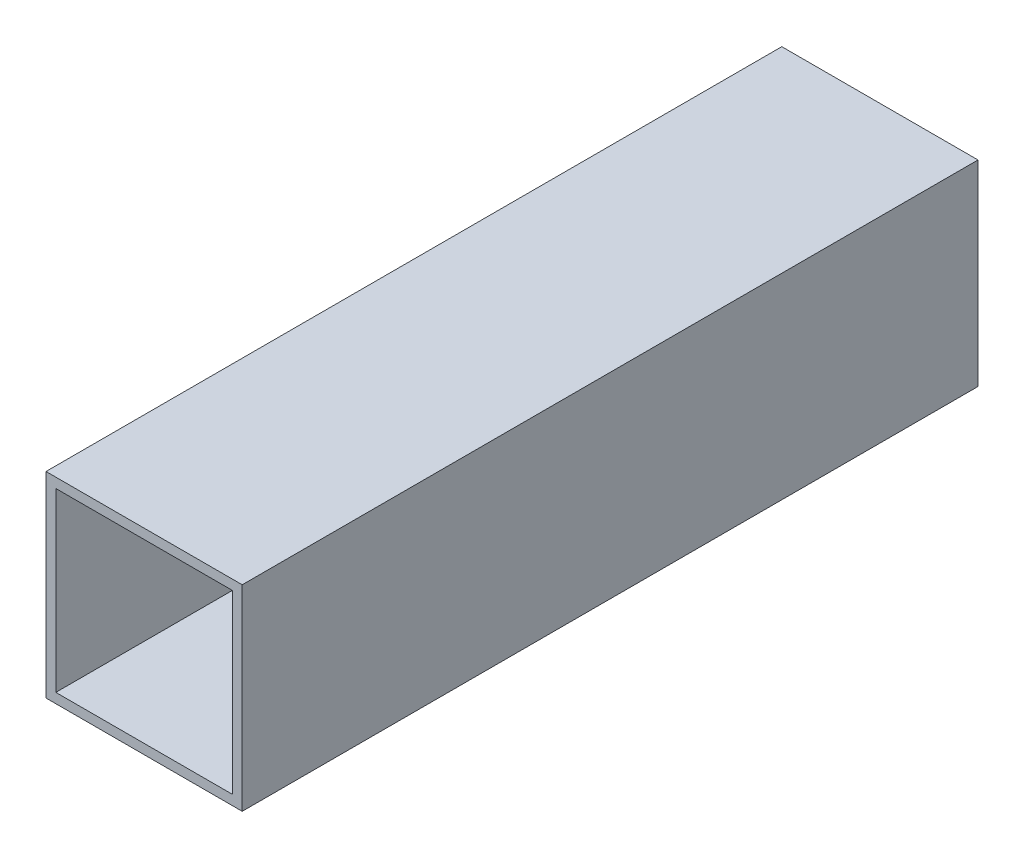
ISO-10303-21;
HEADER;
FILE_DESCRIPTION(('STEP AP214'),'2;1');
FILE_NAME('part.step','',(''),(''),'','','');
FILE_SCHEMA(('AUTOMOTIVE_DESIGN { 1 0 10303 214 1 1 1 1 }'));
ENDSEC;
DATA;
#1=APPLICATION_CONTEXT('core data for automotive mechanical design processes');
#2=APPLICATION_PROTOCOL_DEFINITION('international standard','automotive_design',2000,#1);
#3=PRODUCT_CONTEXT('',#1,'mechanical');
#4=PRODUCT('Part','Part','',(#3));
#5=PRODUCT_RELATED_PRODUCT_CATEGORY('part','',(#4));
#6=PRODUCT_DEFINITION_FORMATION('','',#4);
#7=PRODUCT_DEFINITION_CONTEXT('part definition',#1,'design');
#8=PRODUCT_DEFINITION('design','',#6,#7);
#9=PRODUCT_DEFINITION_SHAPE('','',#8);
#10=(LENGTH_UNIT() NAMED_UNIT(*) SI_UNIT(.MILLI.,.METRE.));
#11=(NAMED_UNIT(*) PLANE_ANGLE_UNIT() SI_UNIT($,.RADIAN.));
#12=(NAMED_UNIT(*) SI_UNIT($,.STERADIAN.) SOLID_ANGLE_UNIT());
#13=UNCERTAINTY_MEASURE_WITH_UNIT(LENGTH_MEASURE(1.E-05),#10,'distance_accuracy_value','');
#14=(GEOMETRIC_REPRESENTATION_CONTEXT(3) GLOBAL_UNCERTAINTY_ASSIGNED_CONTEXT((#13)) GLOBAL_UNIT_ASSIGNED_CONTEXT((#10,
#11,#12)) REPRESENTATION_CONTEXT('',''));
#15=CARTESIAN_POINT('',(0.,0.,0.));
#16=DIRECTION('',(0.,0.,1.));
#17=DIRECTION('',(1.,0.,0.));
#18=AXIS2_PLACEMENT_3D('',#15,#16,#17);
#19=CARTESIAN_POINT('',(0.,0.,300.));
#20=DIRECTION('',(0.,0.,-1.));
#21=DIRECTION('',(-1.,0.,0.));
#22=AXIS2_PLACEMENT_3D('',#19,#20,#21);
#23=PLANE('',#22);
#24=DIRECTION('',(0.,-1.,0.));
#25=VECTOR('',#24,1.);
#26=CARTESIAN_POINT('',(-40.,-40.,300.));
#27=LINE('',#26,#25);
#28=CARTESIAN_POINT('',(-40.,40.,300.));
#29=VERTEX_POINT('',#28);
#30=CARTESIAN_POINT('',(-40.,-40.,300.));
#31=VERTEX_POINT('',#30);
#32=EDGE_CURVE('E140',#29,#31,#27,.T.);
#33=ORIENTED_EDGE('',*,*,#32,.T.);
#34=DIRECTION('',(1.,0.,0.));
#35=VECTOR('',#34,1.);
#36=CARTESIAN_POINT('',(-40.,-40.,300.));
#37=LINE('',#36,#35);
#38=CARTESIAN_POINT('',(40.,-40.,300.));
#39=VERTEX_POINT('',#38);
#40=EDGE_CURVE('E143',#31,#39,#37,.T.);
#41=ORIENTED_EDGE('',*,*,#40,.T.);
#42=DIRECTION('',(0.,1.,0.));
#43=VECTOR('',#42,1.);
#44=CARTESIAN_POINT('',(40.,-40.,300.));
#45=LINE('',#44,#43);
#46=CARTESIAN_POINT('',(40.,40.,300.));
#47=VERTEX_POINT('',#46);
#48=EDGE_CURVE('E146',#39,#47,#45,.T.);
#49=ORIENTED_EDGE('',*,*,#48,.T.);
#50=DIRECTION('',(-1.,0.,0.));
#51=VECTOR('',#50,1.);
#52=CARTESIAN_POINT('',(-40.,40.,300.));
#53=LINE('',#52,#51);
#54=EDGE_CURVE('E148',#47,#29,#53,.T.);
#55=ORIENTED_EDGE('',*,*,#54,.T.);
#56=EDGE_LOOP('',(#33,#41,#49,#55));
#57=FACE_BOUND('',#56,.T.);
#58=DIRECTION('',(0.,-1.,0.));
#59=VECTOR('',#58,1.);
#60=CARTESIAN_POINT('',(-36.,-36.,300.));
#61=LINE('',#60,#59);
#62=CARTESIAN_POINT('',(-36.,36.,300.));
#63=VERTEX_POINT('',#62);
#64=CARTESIAN_POINT('',(-36.,-36.,300.));
#65=VERTEX_POINT('',#64);
#66=EDGE_CURVE('E104',#63,#65,#61,.T.);
#67=ORIENTED_EDGE('',*,*,#66,.F.);
#68=DIRECTION('',(-1.,0.,0.));
#69=VECTOR('',#68,1.);
#70=CARTESIAN_POINT('',(-36.,36.,300.));
#71=LINE('',#70,#69);
#72=CARTESIAN_POINT('',(36.,36.,300.));
#73=VERTEX_POINT('',#72);
#74=EDGE_CURVE('E126',#73,#63,#71,.T.);
#75=ORIENTED_EDGE('',*,*,#74,.F.);
#76=DIRECTION('',(0.,1.,0.));
#77=VECTOR('',#76,1.);
#78=CARTESIAN_POINT('',(36.,-36.,300.));
#79=LINE('',#78,#77);
#80=CARTESIAN_POINT('',(36.,-36.,300.));
#81=VERTEX_POINT('',#80);
#82=EDGE_CURVE('E124',#81,#73,#79,.T.);
#83=ORIENTED_EDGE('',*,*,#82,.F.);
#84=DIRECTION('',(1.,0.,0.));
#85=VECTOR('',#84,1.);
#86=CARTESIAN_POINT('',(-36.,-36.,300.));
#87=LINE('',#86,#85);
#88=EDGE_CURVE('E112',#65,#81,#87,.T.);
#89=ORIENTED_EDGE('',*,*,#88,.F.);
#90=EDGE_LOOP('',(#67,#75,#83,#89));
#91=FACE_BOUND('',#90,.T.);
#92=ADVANCED_FACE('F39',(#57,#91),#23,.F.);
#93=CARTESIAN_POINT('',(0.,0.,0.));
#94=DIRECTION('',(0.,0.,-1.));
#95=DIRECTION('',(-1.,0.,0.));
#96=AXIS2_PLACEMENT_3D('',#93,#94,#95);
#97=PLANE('',#96);
#98=DIRECTION('',(0.,-1.,0.));
#99=VECTOR('',#98,1.);
#100=CARTESIAN_POINT('',(-40.,-40.,0.));
#101=LINE('',#100,#99);
#102=CARTESIAN_POINT('',(-40.,40.,0.));
#103=VERTEX_POINT('',#102);
#104=CARTESIAN_POINT('',(-40.,-40.,0.));
#105=VERTEX_POINT('',#104);
#106=EDGE_CURVE('E120',#103,#105,#101,.T.);
#107=ORIENTED_EDGE('',*,*,#106,.F.);
#108=DIRECTION('',(-1.,0.,0.));
#109=VECTOR('',#108,1.);
#110=CARTESIAN_POINT('',(-40.,40.,0.));
#111=LINE('',#110,#109);
#112=CARTESIAN_POINT('',(40.,40.,0.));
#113=VERTEX_POINT('',#112);
#114=EDGE_CURVE('E144',#113,#103,#111,.T.);
#115=ORIENTED_EDGE('',*,*,#114,.F.);
#116=DIRECTION('',(0.,1.,0.));
#117=VECTOR('',#116,1.);
#118=CARTESIAN_POINT('',(40.,-40.,0.));
#119=LINE('',#118,#117);
#120=CARTESIAN_POINT('',(40.,-40.,0.));
#121=VERTEX_POINT('',#120);
#122=EDGE_CURVE('E155',#121,#113,#119,.T.);
#123=ORIENTED_EDGE('',*,*,#122,.F.);
#124=DIRECTION('',(1.,0.,0.));
#125=VECTOR('',#124,1.);
#126=CARTESIAN_POINT('',(-40.,-40.,0.));
#127=LINE('',#126,#125);
#128=EDGE_CURVE('E153',#105,#121,#127,.T.);
#129=ORIENTED_EDGE('',*,*,#128,.F.);
#130=EDGE_LOOP('',(#107,#115,#123,#129));
#131=FACE_BOUND('',#130,.T.);
#132=DIRECTION('',(-1.,0.,0.));
#133=VECTOR('',#132,1.);
#134=CARTESIAN_POINT('',(-36.,36.,0.));
#135=LINE('',#134,#133);
#136=CARTESIAN_POINT('',(36.,36.,0.));
#137=VERTEX_POINT('',#136);
#138=CARTESIAN_POINT('',(-36.,36.,0.));
#139=VERTEX_POINT('',#138);
#140=EDGE_CURVE('E113',#137,#139,#135,.T.);
#141=ORIENTED_EDGE('',*,*,#140,.T.);
#142=DIRECTION('',(0.,-1.,0.));
#143=VECTOR('',#142,1.);
#144=CARTESIAN_POINT('',(-36.,-36.,0.));
#145=LINE('',#144,#143);
#146=CARTESIAN_POINT('',(-36.,-36.,0.));
#147=VERTEX_POINT('',#146);
#148=EDGE_CURVE('E62',#139,#147,#145,.T.);
#149=ORIENTED_EDGE('',*,*,#148,.T.);
#150=DIRECTION('',(1.,0.,0.));
#151=VECTOR('',#150,1.);
#152=CARTESIAN_POINT('',(-36.,-36.,0.));
#153=LINE('',#152,#151);
#154=CARTESIAN_POINT('',(36.,-36.,0.));
#155=VERTEX_POINT('',#154);
#156=EDGE_CURVE('E119',#147,#155,#153,.T.);
#157=ORIENTED_EDGE('',*,*,#156,.T.);
#158=DIRECTION('',(0.,1.,0.));
#159=VECTOR('',#158,1.);
#160=CARTESIAN_POINT('',(36.,-36.,0.));
#161=LINE('',#160,#159);
#162=EDGE_CURVE('E132',#155,#137,#161,.T.);
#163=ORIENTED_EDGE('',*,*,#162,.T.);
#164=EDGE_LOOP('',(#141,#149,#157,#163));
#165=FACE_BOUND('',#164,.T.);
#166=ADVANCED_FACE('F173',(#131,#165),#97,.T.);
#167=CARTESIAN_POINT('',(-40.,-40.,300.));
#168=DIRECTION('',(1.,0.,0.));
#169=DIRECTION('',(0.,0.,-1.));
#170=AXIS2_PLACEMENT_3D('',#167,#168,#169);
#171=PLANE('',#170);
#172=ORIENTED_EDGE('',*,*,#106,.T.);
#173=DIRECTION('',(0.,0.,-1.));
#174=VECTOR('',#173,1.);
#175=CARTESIAN_POINT('',(-40.,-40.,300.));
#176=LINE('',#175,#174);
#177=EDGE_CURVE('E11',#31,#105,#176,.T.);
#178=ORIENTED_EDGE('',*,*,#177,.F.);
#179=ORIENTED_EDGE('',*,*,#32,.F.);
#180=DIRECTION('',(0.,0.,-1.));
#181=VECTOR('',#180,1.);
#182=CARTESIAN_POINT('',(-40.,40.,300.));
#183=LINE('',#182,#181);
#184=EDGE_CURVE('E150',#29,#103,#183,.T.);
#185=ORIENTED_EDGE('',*,*,#184,.T.);
#186=EDGE_LOOP('',(#172,#178,#179,#185));
#187=FACE_BOUND('',#186,.T.);
#188=ADVANCED_FACE('F41',(#187),#171,.F.);
#189=CARTESIAN_POINT('',(-40.,-40.,300.));
#190=DIRECTION('',(0.,1.,0.));
#191=DIRECTION('',(0.,0.,1.));
#192=AXIS2_PLACEMENT_3D('',#189,#190,#191);
#193=PLANE('',#192);
#194=ORIENTED_EDGE('',*,*,#128,.T.);
#195=DIRECTION('',(0.,0.,-1.));
#196=VECTOR('',#195,1.);
#197=CARTESIAN_POINT('',(40.,-40.,300.));
#198=LINE('',#197,#196);
#199=EDGE_CURVE('E47',#39,#121,#198,.T.);
#200=ORIENTED_EDGE('',*,*,#199,.F.);
#201=ORIENTED_EDGE('',*,*,#40,.F.);
#202=ORIENTED_EDGE('',*,*,#177,.T.);
#203=EDGE_LOOP('',(#194,#200,#201,#202));
#204=FACE_BOUND('',#203,.T.);
#205=ADVANCED_FACE('F183',(#204),#193,.F.);
#206=CARTESIAN_POINT('',(40.,-40.,300.));
#207=DIRECTION('',(-1.,0.,0.));
#208=DIRECTION('',(0.,0.,1.));
#209=AXIS2_PLACEMENT_3D('',#206,#207,#208);
#210=PLANE('',#209);
#211=ORIENTED_EDGE('',*,*,#122,.T.);
#212=DIRECTION('',(0.,0.,-1.));
#213=VECTOR('',#212,1.);
#214=CARTESIAN_POINT('',(40.,40.,300.));
#215=LINE('',#214,#213);
#216=EDGE_CURVE('E160',#47,#113,#215,.T.);
#217=ORIENTED_EDGE('',*,*,#216,.F.);
#218=ORIENTED_EDGE('',*,*,#48,.F.);
#219=ORIENTED_EDGE('',*,*,#199,.T.);
#220=EDGE_LOOP('',(#211,#217,#218,#219));
#221=FACE_BOUND('',#220,.T.);
#222=ADVANCED_FACE('F167',(#221),#210,.F.);
#223=CARTESIAN_POINT('',(-40.,40.,300.));
#224=DIRECTION('',(0.,-1.,0.));
#225=DIRECTION('',(0.,0.,-1.));
#226=AXIS2_PLACEMENT_3D('',#223,#224,#225);
#227=PLANE('',#226);
#228=ORIENTED_EDGE('',*,*,#114,.T.);
#229=ORIENTED_EDGE('',*,*,#184,.F.);
#230=ORIENTED_EDGE('',*,*,#54,.F.);
#231=ORIENTED_EDGE('',*,*,#216,.T.);
#232=EDGE_LOOP('',(#228,#229,#230,#231));
#233=FACE_BOUND('',#232,.T.);
#234=ADVANCED_FACE('F177',(#233),#227,.F.);
#235=CARTESIAN_POINT('',(-36.,-36.,300.));
#236=DIRECTION('',(1.,0.,0.));
#237=DIRECTION('',(0.,0.,-1.));
#238=AXIS2_PLACEMENT_3D('',#235,#236,#237);
#239=PLANE('',#238);
#240=ORIENTED_EDGE('',*,*,#148,.F.);
#241=DIRECTION('',(0.,0.,-1.));
#242=VECTOR('',#241,1.);
#243=CARTESIAN_POINT('',(-36.,36.,300.));
#244=LINE('',#243,#242);
#245=EDGE_CURVE('E108',#63,#139,#244,.T.);
#246=ORIENTED_EDGE('',*,*,#245,.F.);
#247=ORIENTED_EDGE('',*,*,#66,.T.);
#248=DIRECTION('',(0.,0.,-1.));
#249=VECTOR('',#248,1.);
#250=CARTESIAN_POINT('',(-36.,-36.,300.));
#251=LINE('',#250,#249);
#252=EDGE_CURVE('E107',#65,#147,#251,.T.);
#253=ORIENTED_EDGE('',*,*,#252,.T.);
#254=EDGE_LOOP('',(#240,#246,#247,#253));
#255=FACE_BOUND('',#254,.T.);
#256=ADVANCED_FACE('F106',(#255),#239,.T.);
#257=CARTESIAN_POINT('',(-36.,-36.,300.));
#258=DIRECTION('',(0.,1.,0.));
#259=DIRECTION('',(0.,0.,1.));
#260=AXIS2_PLACEMENT_3D('',#257,#258,#259);
#261=PLANE('',#260);
#262=ORIENTED_EDGE('',*,*,#156,.F.);
#263=ORIENTED_EDGE('',*,*,#252,.F.);
#264=ORIENTED_EDGE('',*,*,#88,.T.);
#265=DIRECTION('',(0.,0.,-1.));
#266=VECTOR('',#265,1.);
#267=CARTESIAN_POINT('',(36.,-36.,300.));
#268=LINE('',#267,#266);
#269=EDGE_CURVE('E121',#81,#155,#268,.T.);
#270=ORIENTED_EDGE('',*,*,#269,.T.);
#271=EDGE_LOOP('',(#262,#263,#264,#270));
#272=FACE_BOUND('',#271,.T.);
#273=ADVANCED_FACE('F116',(#272),#261,.T.);
#274=CARTESIAN_POINT('',(36.,-36.,300.));
#275=DIRECTION('',(-1.,0.,0.));
#276=DIRECTION('',(0.,0.,1.));
#277=AXIS2_PLACEMENT_3D('',#274,#275,#276);
#278=PLANE('',#277);
#279=ORIENTED_EDGE('',*,*,#162,.F.);
#280=ORIENTED_EDGE('',*,*,#269,.F.);
#281=ORIENTED_EDGE('',*,*,#82,.T.);
#282=DIRECTION('',(0.,0.,-1.));
#283=VECTOR('',#282,1.);
#284=CARTESIAN_POINT('',(36.,36.,300.));
#285=LINE('',#284,#283);
#286=EDGE_CURVE('E54',#73,#137,#285,.T.);
#287=ORIENTED_EDGE('',*,*,#286,.T.);
#288=EDGE_LOOP('',(#279,#280,#281,#287));
#289=FACE_BOUND('',#288,.T.);
#290=ADVANCED_FACE('F206',(#289),#278,.T.);
#291=CARTESIAN_POINT('',(-36.,36.,300.));
#292=DIRECTION('',(0.,-1.,0.));
#293=DIRECTION('',(0.,0.,-1.));
#294=AXIS2_PLACEMENT_3D('',#291,#292,#293);
#295=PLANE('',#294);
#296=ORIENTED_EDGE('',*,*,#140,.F.);
#297=ORIENTED_EDGE('',*,*,#286,.F.);
#298=ORIENTED_EDGE('',*,*,#74,.T.);
#299=ORIENTED_EDGE('',*,*,#245,.T.);
#300=EDGE_LOOP('',(#296,#297,#298,#299));
#301=FACE_BOUND('',#300,.T.);
#302=ADVANCED_FACE('F210',(#301),#295,.T.);
#303=CLOSED_SHELL('',(#92,#166,#188,#205,#222,#234,#256,#273,#290,#302));
#304=MANIFOLD_SOLID_BREP('B2',#303);
#305=ADVANCED_BREP_SHAPE_REPRESENTATION('',(#18,#304),#14);
#306=SHAPE_DEFINITION_REPRESENTATION(#9,#305);
ENDSEC;
END-ISO-10303-21;
